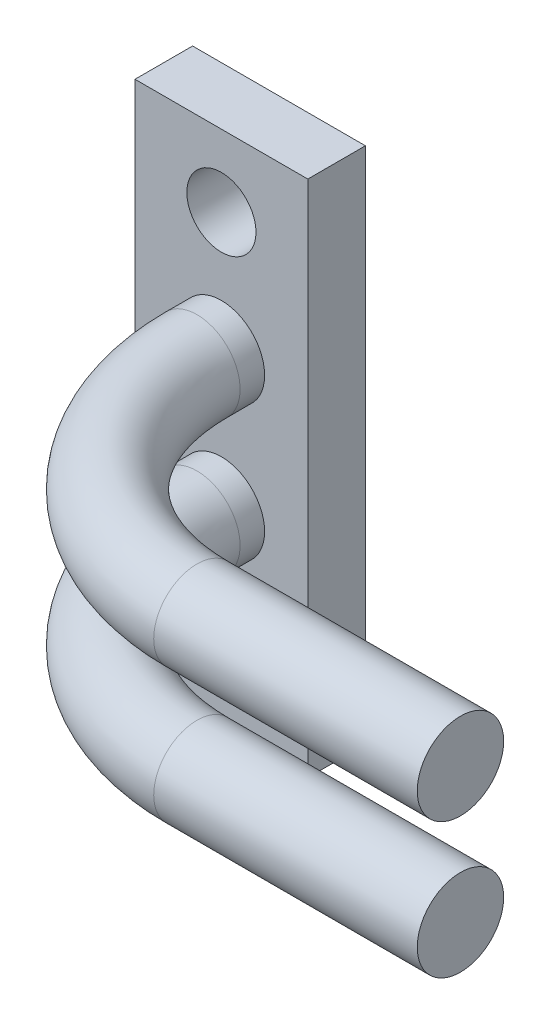
ISO-10303-21;
HEADER;
FILE_DESCRIPTION(('STEP AP214'),'2;1');
FILE_NAME('part.step','',(''),(''),'','','');
FILE_SCHEMA(('AUTOMOTIVE_DESIGN { 1 0 10303 214 1 1 1 1 }'));
ENDSEC;
DATA;
#1=APPLICATION_CONTEXT('core data for automotive mechanical design processes');
#2=APPLICATION_PROTOCOL_DEFINITION('international standard','automotive_design',2000,#1);
#3=PRODUCT_CONTEXT('',#1,'mechanical');
#4=PRODUCT('Part','Part','',(#3));
#5=PRODUCT_RELATED_PRODUCT_CATEGORY('part','',(#4));
#6=PRODUCT_DEFINITION_FORMATION('','',#4);
#7=PRODUCT_DEFINITION_CONTEXT('part definition',#1,'design');
#8=PRODUCT_DEFINITION('design','',#6,#7);
#9=PRODUCT_DEFINITION_SHAPE('','',#8);
#10=(LENGTH_UNIT() NAMED_UNIT(*) SI_UNIT(.MILLI.,.METRE.));
#11=(NAMED_UNIT(*) PLANE_ANGLE_UNIT() SI_UNIT($,.RADIAN.));
#12=(NAMED_UNIT(*) SI_UNIT($,.STERADIAN.) SOLID_ANGLE_UNIT());
#13=UNCERTAINTY_MEASURE_WITH_UNIT(LENGTH_MEASURE(1.E-05),#10,'distance_accuracy_value','');
#14=(GEOMETRIC_REPRESENTATION_CONTEXT(3) GLOBAL_UNCERTAINTY_ASSIGNED_CONTEXT((#13)) GLOBAL_UNIT_ASSIGNED_CONTEXT((#10,
#11,#12)) REPRESENTATION_CONTEXT('',''));
#15=CARTESIAN_POINT('',(0.,0.,0.));
#16=DIRECTION('',(0.,0.,1.));
#17=DIRECTION('',(1.,0.,0.));
#18=AXIS2_PLACEMENT_3D('',#15,#16,#17);
#19=CARTESIAN_POINT('',(3.,9.,2.));
#20=DIRECTION('',(0.,0.,-1.));
#21=DIRECTION('',(-1.,0.,0.));
#22=AXIS2_PLACEMENT_3D('',#19,#20,#21);
#23=PLANE('',#22);
#24=CARTESIAN_POINT('',(0.,-6.5,2.));
#25=DIRECTION('',(0.,0.,1.));
#26=DIRECTION('',(-1.,0.,0.));
#27=AXIS2_PLACEMENT_3D('',#24,#25,#26);
#28=CIRCLE('',#27,1.2);
#29=CARTESIAN_POINT('',(-1.19999999999999,-6.5,2.));
#30=VERTEX_POINT('',#29);
#31=EDGE_CURVE('E130',#30,#30,#28,.T.);
#32=ORIENTED_EDGE('',*,*,#31,.F.);
#33=EDGE_LOOP('',(#32));
#34=FACE_BOUND('',#33,.T.);
#35=CARTESIAN_POINT('',(0.,6.5,2.));
#36=DIRECTION('',(0.,0.,1.));
#37=DIRECTION('',(1.,0.,0.));
#38=AXIS2_PLACEMENT_3D('',#35,#36,#37);
#39=CIRCLE('',#38,1.2);
#40=CARTESIAN_POINT('',(1.2,6.5,2.));
#41=VERTEX_POINT('',#40);
#42=EDGE_CURVE('E119',#41,#41,#39,.T.);
#43=ORIENTED_EDGE('',*,*,#42,.F.);
#44=EDGE_LOOP('',(#43));
#45=FACE_BOUND('',#44,.T.);
#46=CARTESIAN_POINT('',(0.,-2.35,2.));
#47=DIRECTION('',(0.,0.,1.));
#48=DIRECTION('',(1.,0.,0.));
#49=AXIS2_PLACEMENT_3D('',#46,#47,#48);
#50=CIRCLE('',#49,1.5);
#51=CARTESIAN_POINT('',(1.5,-2.35,2.));
#52=VERTEX_POINT('',#51);
#53=EDGE_CURVE('E41',#52,#52,#50,.T.);
#54=ORIENTED_EDGE('',*,*,#53,.F.);
#55=EDGE_LOOP('',(#54));
#56=FACE_BOUND('',#55,.T.);
#57=DIRECTION('',(0.,1.,0.));
#58=VECTOR('',#57,1.);
#59=CARTESIAN_POINT('',(3.,-9.,2.));
#60=LINE('',#59,#58);
#61=CARTESIAN_POINT('',(3.,-9.,2.));
#62=VERTEX_POINT('',#61);
#63=CARTESIAN_POINT('',(3.,9.,2.));
#64=VERTEX_POINT('',#63);
#65=EDGE_CURVE('E86',#62,#64,#60,.T.);
#66=ORIENTED_EDGE('',*,*,#65,.T.);
#67=DIRECTION('',(-1.,0.,0.));
#68=VECTOR('',#67,1.);
#69=CARTESIAN_POINT('',(-3.,9.,2.));
#70=LINE('',#69,#68);
#71=CARTESIAN_POINT('',(-3.,9.,2.));
#72=VERTEX_POINT('',#71);
#73=EDGE_CURVE('E81',#64,#72,#70,.T.);
#74=ORIENTED_EDGE('',*,*,#73,.T.);
#75=DIRECTION('',(0.,-1.,0.));
#76=VECTOR('',#75,1.);
#77=CARTESIAN_POINT('',(-3.,-9.,2.));
#78=LINE('',#77,#76);
#79=CARTESIAN_POINT('',(-3.,-9.,2.));
#80=VERTEX_POINT('',#79);
#81=EDGE_CURVE('E84',#72,#80,#78,.T.);
#82=ORIENTED_EDGE('',*,*,#81,.T.);
#83=DIRECTION('',(1.,0.,0.));
#84=VECTOR('',#83,1.);
#85=CARTESIAN_POINT('',(-3.,-9.,2.));
#86=LINE('',#85,#84);
#87=EDGE_CURVE('E50',#80,#62,#86,.T.);
#88=ORIENTED_EDGE('',*,*,#87,.T.);
#89=EDGE_LOOP('',(#66,#74,#82,#88));
#90=FACE_BOUND('',#89,.T.);
#91=CARTESIAN_POINT('',(0.,2.35,2.));
#92=DIRECTION('',(0.,0.,1.));
#93=DIRECTION('',(1.,0.,0.));
#94=AXIS2_PLACEMENT_3D('',#91,#92,#93);
#95=CIRCLE('',#94,1.5);
#96=CARTESIAN_POINT('',(1.5,2.35,2.));
#97=VERTEX_POINT('',#96);
#98=EDGE_CURVE('E11',#97,#97,#95,.T.);
#99=ORIENTED_EDGE('',*,*,#98,.F.);
#100=EDGE_LOOP('',(#99));
#101=FACE_BOUND('',#100,.T.);
#102=ADVANCED_FACE('F31',(#34,#45,#56,#90,#101),#23,.F.);
#103=CARTESIAN_POINT('',(3.,9.,0.));
#104=DIRECTION('',(0.,0.,-1.));
#105=DIRECTION('',(-1.,0.,0.));
#106=AXIS2_PLACEMENT_3D('',#103,#104,#105);
#107=PLANE('',#106);
#108=CARTESIAN_POINT('',(0.,-6.5,0.));
#109=DIRECTION('',(0.,0.,-1.));
#110=DIRECTION('',(-1.,0.,0.));
#111=AXIS2_PLACEMENT_3D('',#108,#109,#110);
#112=CIRCLE('',#111,1.2);
#113=CARTESIAN_POINT('',(-1.19999999999999,-6.5,0.));
#114=VERTEX_POINT('',#113);
#115=EDGE_CURVE('E35',#114,#114,#112,.T.);
#116=ORIENTED_EDGE('',*,*,#115,.F.);
#117=EDGE_LOOP('',(#116));
#118=FACE_BOUND('',#117,.T.);
#119=CARTESIAN_POINT('',(0.,6.5,0.));
#120=DIRECTION('',(0.,0.,-1.));
#121=DIRECTION('',(-1.,0.,0.));
#122=AXIS2_PLACEMENT_3D('',#119,#120,#121);
#123=CIRCLE('',#122,1.2);
#124=CARTESIAN_POINT('',(-1.2,6.5,0.));
#125=VERTEX_POINT('',#124);
#126=EDGE_CURVE('E116',#125,#125,#123,.T.);
#127=ORIENTED_EDGE('',*,*,#126,.F.);
#128=EDGE_LOOP('',(#127));
#129=FACE_BOUND('',#128,.T.);
#130=CARTESIAN_POINT('',(0.,2.35,0.));
#131=DIRECTION('',(0.,0.,-1.));
#132=DIRECTION('',(-1.,0.,0.));
#133=AXIS2_PLACEMENT_3D('',#130,#131,#132);
#134=CIRCLE('',#133,1.5);
#135=CARTESIAN_POINT('',(-1.5,2.35,0.));
#136=VERTEX_POINT('',#135);
#137=EDGE_CURVE('E104',#136,#136,#134,.T.);
#138=ORIENTED_EDGE('',*,*,#137,.F.);
#139=EDGE_LOOP('',(#138));
#140=FACE_BOUND('',#139,.T.);
#141=DIRECTION('',(0.,1.,0.));
#142=VECTOR('',#141,1.);
#143=CARTESIAN_POINT('',(3.,-9.,0.));
#144=LINE('',#143,#142);
#145=CARTESIAN_POINT('',(3.,-9.,0.));
#146=VERTEX_POINT('',#145);
#147=CARTESIAN_POINT('',(3.,9.,0.));
#148=VERTEX_POINT('',#147);
#149=EDGE_CURVE('E101',#146,#148,#144,.T.);
#150=ORIENTED_EDGE('',*,*,#149,.F.);
#151=DIRECTION('',(1.,0.,0.));
#152=VECTOR('',#151,1.);
#153=CARTESIAN_POINT('',(-3.,-9.,0.));
#154=LINE('',#153,#152);
#155=CARTESIAN_POINT('',(-3.,-9.,0.));
#156=VERTEX_POINT('',#155);
#157=EDGE_CURVE('E73',#156,#146,#154,.T.);
#158=ORIENTED_EDGE('',*,*,#157,.F.);
#159=DIRECTION('',(0.,-1.,0.));
#160=VECTOR('',#159,1.);
#161=CARTESIAN_POINT('',(-3.,-9.,0.));
#162=LINE('',#161,#160);
#163=CARTESIAN_POINT('',(-3.,9.,0.));
#164=VERTEX_POINT('',#163);
#165=EDGE_CURVE('E67',#164,#156,#162,.T.);
#166=ORIENTED_EDGE('',*,*,#165,.F.);
#167=DIRECTION('',(-1.,0.,0.));
#168=VECTOR('',#167,1.);
#169=CARTESIAN_POINT('',(-3.,9.,0.));
#170=LINE('',#169,#168);
#171=EDGE_CURVE('E91',#148,#164,#170,.T.);
#172=ORIENTED_EDGE('',*,*,#171,.F.);
#173=EDGE_LOOP('',(#150,#158,#166,#172));
#174=FACE_BOUND('',#173,.T.);
#175=CARTESIAN_POINT('',(0.,-2.35,0.));
#176=DIRECTION('',(0.,0.,-1.));
#177=DIRECTION('',(-1.,0.,0.));
#178=AXIS2_PLACEMENT_3D('',#175,#176,#177);
#179=CIRCLE('',#178,1.5);
#180=CARTESIAN_POINT('',(-1.5,-2.35,0.));
#181=VERTEX_POINT('',#180);
#182=EDGE_CURVE('E149',#181,#181,#179,.T.);
#183=ORIENTED_EDGE('',*,*,#182,.F.);
#184=EDGE_LOOP('',(#183));
#185=FACE_BOUND('',#184,.T.);
#186=ADVANCED_FACE('F157',(#118,#129,#140,#174,#185),#107,.T.);
#187=CARTESIAN_POINT('',(3.,-9.,2.));
#188=DIRECTION('',(-1.,0.,0.));
#189=DIRECTION('',(0.,0.,1.));
#190=AXIS2_PLACEMENT_3D('',#187,#188,#189);
#191=PLANE('',#190);
#192=ORIENTED_EDGE('',*,*,#149,.T.);
#193=DIRECTION('',(0.,0.,-1.));
#194=VECTOR('',#193,1.);
#195=CARTESIAN_POINT('',(3.,9.,2.));
#196=LINE('',#195,#194);
#197=EDGE_CURVE('E92',#64,#148,#196,.T.);
#198=ORIENTED_EDGE('',*,*,#197,.F.);
#199=ORIENTED_EDGE('',*,*,#65,.F.);
#200=DIRECTION('',(0.,0.,-1.));
#201=VECTOR('',#200,1.);
#202=CARTESIAN_POINT('',(3.,-9.,2.));
#203=LINE('',#202,#201);
#204=EDGE_CURVE('E97',#62,#146,#203,.T.);
#205=ORIENTED_EDGE('',*,*,#204,.T.);
#206=EDGE_LOOP('',(#192,#198,#199,#205));
#207=FACE_BOUND('',#206,.T.);
#208=ADVANCED_FACE('F160',(#207),#191,.F.);
#209=CARTESIAN_POINT('',(-3.,9.,2.));
#210=DIRECTION('',(0.,-1.,0.));
#211=DIRECTION('',(0.,0.,-1.));
#212=AXIS2_PLACEMENT_3D('',#209,#210,#211);
#213=PLANE('',#212);
#214=ORIENTED_EDGE('',*,*,#171,.T.);
#215=DIRECTION('',(0.,0.,-1.));
#216=VECTOR('',#215,1.);
#217=CARTESIAN_POINT('',(-3.,9.,2.));
#218=LINE('',#217,#216);
#219=EDGE_CURVE('E89',#72,#164,#218,.T.);
#220=ORIENTED_EDGE('',*,*,#219,.F.);
#221=ORIENTED_EDGE('',*,*,#73,.F.);
#222=ORIENTED_EDGE('',*,*,#197,.T.);
#223=EDGE_LOOP('',(#214,#220,#221,#222));
#224=FACE_BOUND('',#223,.T.);
#225=ADVANCED_FACE('F90',(#224),#213,.F.);
#226=CARTESIAN_POINT('',(-3.,-9.,2.));
#227=DIRECTION('',(1.,0.,0.));
#228=DIRECTION('',(0.,0.,-1.));
#229=AXIS2_PLACEMENT_3D('',#226,#227,#228);
#230=PLANE('',#229);
#231=ORIENTED_EDGE('',*,*,#165,.T.);
#232=DIRECTION('',(0.,0.,-1.));
#233=VECTOR('',#232,1.);
#234=CARTESIAN_POINT('',(-3.,-9.,2.));
#235=LINE('',#234,#233);
#236=EDGE_CURVE('E93',#80,#156,#235,.T.);
#237=ORIENTED_EDGE('',*,*,#236,.F.);
#238=ORIENTED_EDGE('',*,*,#81,.F.);
#239=ORIENTED_EDGE('',*,*,#219,.T.);
#240=EDGE_LOOP('',(#231,#237,#238,#239));
#241=FACE_BOUND('',#240,.T.);
#242=ADVANCED_FACE('F95',(#241),#230,.F.);
#243=CARTESIAN_POINT('',(-3.,-9.,2.));
#244=DIRECTION('',(0.,1.,0.));
#245=DIRECTION('',(0.,0.,1.));
#246=AXIS2_PLACEMENT_3D('',#243,#244,#245);
#247=PLANE('',#246);
#248=ORIENTED_EDGE('',*,*,#157,.T.);
#249=ORIENTED_EDGE('',*,*,#204,.F.);
#250=ORIENTED_EDGE('',*,*,#87,.F.);
#251=ORIENTED_EDGE('',*,*,#236,.T.);
#252=EDGE_LOOP('',(#248,#249,#250,#251));
#253=FACE_BOUND('',#252,.T.);
#254=ADVANCED_FACE('F177',(#253),#247,.F.);
#255=CARTESIAN_POINT('',(0.,2.35,-2.1));
#256=DIRECTION('',(0.,0.,1.));
#257=DIRECTION('',(1.,0.,0.));
#258=AXIS2_PLACEMENT_3D('',#255,#256,#257);
#259=CYLINDRICAL_SURFACE('',#258,1.5);
#260=CARTESIAN_POINT('',(0.,2.35,-0.6));
#261=DIRECTION('',(0.,0.,1.));
#262=DIRECTION('',(1.,0.,0.));
#263=AXIS2_PLACEMENT_3D('',#260,#261,#262);
#264=CIRCLE('',#263,1.5);
#265=CARTESIAN_POINT('',(1.5,2.35,-0.6));
#266=VERTEX_POINT('',#265);
#267=EDGE_CURVE('E114',#266,#266,#264,.T.);
#268=ORIENTED_EDGE('',*,*,#267,.T.);
#269=EDGE_LOOP('',(#268));
#270=FACE_BOUND('',#269,.T.);
#271=ORIENTED_EDGE('',*,*,#137,.T.);
#272=EDGE_LOOP('',(#271));
#273=FACE_BOUND('',#272,.T.);
#274=ADVANCED_FACE('F155',(#270,#273),#259,.T.);
#275=CARTESIAN_POINT('',(0.,-2.35,-2.1));
#276=DIRECTION('',(0.,0.,1.));
#277=DIRECTION('',(1.,0.,0.));
#278=AXIS2_PLACEMENT_3D('',#275,#276,#277);
#279=CYLINDRICAL_SURFACE('',#278,1.5);
#280=CARTESIAN_POINT('',(0.,-2.35,-0.6));
#281=DIRECTION('',(0.,0.,1.));
#282=DIRECTION('',(1.,0.,0.));
#283=AXIS2_PLACEMENT_3D('',#280,#281,#282);
#284=CIRCLE('',#283,1.5);
#285=CARTESIAN_POINT('',(1.5,-2.35,-0.6));
#286=VERTEX_POINT('',#285);
#287=EDGE_CURVE('E111',#286,#286,#284,.T.);
#288=ORIENTED_EDGE('',*,*,#287,.T.);
#289=EDGE_LOOP('',(#288));
#290=FACE_BOUND('',#289,.T.);
#291=ORIENTED_EDGE('',*,*,#182,.T.);
#292=EDGE_LOOP('',(#291));
#293=FACE_BOUND('',#292,.T.);
#294=ADVANCED_FACE('F167',(#290,#293),#279,.T.);
#295=CARTESIAN_POINT('',(0.,-2.35,-0.6));
#296=DIRECTION('',(0.,0.,1.));
#297=DIRECTION('',(1.,0.,0.));
#298=AXIS2_PLACEMENT_3D('',#295,#296,#297);
#299=SPHERICAL_SURFACE('',#298,1.5);
#300=ORIENTED_EDGE('',*,*,#287,.F.);
#301=EDGE_LOOP('',(#300));
#302=FACE_BOUND('',#301,.T.);
#303=ADVANCED_FACE('F169',(#302),#299,.T.);
#304=CARTESIAN_POINT('',(0.,2.35,-0.6));
#305=DIRECTION('',(0.,0.,1.));
#306=DIRECTION('',(1.,0.,0.));
#307=AXIS2_PLACEMENT_3D('',#304,#305,#306);
#308=SPHERICAL_SURFACE('',#307,1.5);
#309=ORIENTED_EDGE('',*,*,#267,.F.);
#310=EDGE_LOOP('',(#309));
#311=FACE_BOUND('',#310,.T.);
#312=ADVANCED_FACE('F33',(#311),#308,.T.);
#313=CARTESIAN_POINT('',(7.5,-2.35,10.35));
#314=DIRECTION('',(1.,0.,0.));
#315=DIRECTION('',(0.,0.,-1.));
#316=AXIS2_PLACEMENT_3D('',#313,#314,#315);
#317=CYLINDRICAL_SURFACE('',#316,1.5);
#318=CARTESIAN_POINT('',(7.5,-2.35,10.35));
#319=DIRECTION('',(1.,0.,0.));
#320=DIRECTION('',(0.,0.,-1.));
#321=AXIS2_PLACEMENT_3D('',#318,#319,#320);
#322=CIRCLE('',#321,1.5);
#323=CARTESIAN_POINT('',(7.5,-2.35,11.85));
#324=VERTEX_POINT('',#323);
#325=EDGE_CURVE('E141',#324,#324,#322,.T.);
#326=ORIENTED_EDGE('',*,*,#325,.T.);
#327=EDGE_LOOP('',(#326));
#328=FACE_BOUND('',#327,.T.);
#329=CARTESIAN_POINT('',(16.65,-2.35,10.35));
#330=DIRECTION('',(1.,0.,0.));
#331=DIRECTION('',(0.,0.,-1.));
#332=AXIS2_PLACEMENT_3D('',#329,#330,#331);
#333=CIRCLE('',#332,1.5);
#334=CARTESIAN_POINT('',(16.65,-2.35,8.85));
#335=VERTEX_POINT('',#334);
#336=EDGE_CURVE('E146',#335,#335,#333,.T.);
#337=ORIENTED_EDGE('',*,*,#336,.F.);
#338=EDGE_LOOP('',(#337));
#339=FACE_BOUND('',#338,.T.);
#340=ADVANCED_FACE('F237',(#328,#339),#317,.T.);
#341=CARTESIAN_POINT('',(7.5,-2.35,2.85));
#342=DIRECTION('',(0.,1.,0.));
#343=DIRECTION('',(0.,0.,1.));
#344=AXIS2_PLACEMENT_3D('',#341,#342,#343);
#345=TOROIDAL_SURFACE('',#344,7.5,1.5);
#346=CARTESIAN_POINT('',(0.,-2.35,2.85));
#347=DIRECTION('',(0.,0.,1.));
#348=DIRECTION('',(1.,0.,0.));
#349=AXIS2_PLACEMENT_3D('',#346,#347,#348);
#350=CIRCLE('',#349,1.5);
#351=CARTESIAN_POINT('',(-1.5,-2.35,2.85));
#352=VERTEX_POINT('',#351);
#353=EDGE_CURVE('E138',#352,#352,#350,.T.);
#354=CARTESIAN_POINT('',(7.5,-2.35,2.85));
#355=DIRECTION('',(0.,1.,0.));
#356=DIRECTION('',(0.,0.,1.));
#357=AXIS2_PLACEMENT_3D('',#354,#355,#356);
#358=CIRCLE('',#357,9.);
#359=EDGE_CURVE('',#352,#324,#358,.T.);
#360=ORIENTED_EDGE('',*,*,#353,.T.);
#361=ORIENTED_EDGE('',*,*,#325,.F.);
#362=ORIENTED_EDGE('',*,*,#359,.T.);
#363=ORIENTED_EDGE('',*,*,#359,.F.);
#364=EDGE_LOOP('',(#360,#362,#361,#363));
#365=FACE_BOUND('',#364,.T.);
#366=ADVANCED_FACE('F247',(#365),#345,.T.);
#367=CARTESIAN_POINT('',(0.,-2.35,2.85));
#368=DIRECTION('',(0.,0.,-1.));
#369=DIRECTION('',(-1.,0.,0.));
#370=AXIS2_PLACEMENT_3D('',#367,#368,#369);
#371=CYLINDRICAL_SURFACE('',#370,1.5);
#372=ORIENTED_EDGE('',*,*,#353,.F.);
#373=EDGE_LOOP('',(#372));
#374=FACE_BOUND('',#373,.T.);
#375=ORIENTED_EDGE('',*,*,#53,.T.);
#376=EDGE_LOOP('',(#375));
#377=FACE_BOUND('',#376,.T.);
#378=ADVANCED_FACE('F256',(#374,#377),#371,.T.);
#379=CARTESIAN_POINT('',(16.65,-2.35,10.35));
#380=DIRECTION('',(1.,0.,0.));
#381=DIRECTION('',(0.,0.,-1.));
#382=AXIS2_PLACEMENT_3D('',#379,#380,#381);
#383=PLANE('',#382);
#384=ORIENTED_EDGE('',*,*,#336,.T.);
#385=EDGE_LOOP('',(#384));
#386=FACE_BOUND('',#385,.T.);
#387=ADVANCED_FACE('F266',(#386),#383,.T.);
#388=CARTESIAN_POINT('',(7.5,2.35,10.35));
#389=DIRECTION('',(1.,0.,0.));
#390=DIRECTION('',(0.,0.,-1.));
#391=AXIS2_PLACEMENT_3D('',#388,#389,#390);
#392=CYLINDRICAL_SURFACE('',#391,1.5);
#393=CARTESIAN_POINT('',(7.5,2.35,10.35));
#394=DIRECTION('',(1.,0.,0.));
#395=DIRECTION('',(0.,0.,-1.));
#396=AXIS2_PLACEMENT_3D('',#393,#394,#395);
#397=CIRCLE('',#396,1.5);
#398=CARTESIAN_POINT('',(7.5,2.35,11.85));
#399=VERTEX_POINT('',#398);
#400=EDGE_CURVE('E123',#399,#399,#397,.T.);
#401=ORIENTED_EDGE('',*,*,#400,.T.);
#402=EDGE_LOOP('',(#401));
#403=FACE_BOUND('',#402,.T.);
#404=CARTESIAN_POINT('',(16.65,2.35,10.35));
#405=DIRECTION('',(1.,0.,0.));
#406=DIRECTION('',(0.,0.,-1.));
#407=AXIS2_PLACEMENT_3D('',#404,#405,#406);
#408=CIRCLE('',#407,1.5);
#409=CARTESIAN_POINT('',(16.65,2.35,8.85));
#410=VERTEX_POINT('',#409);
#411=EDGE_CURVE('E135',#410,#410,#408,.T.);
#412=ORIENTED_EDGE('',*,*,#411,.F.);
#413=EDGE_LOOP('',(#412));
#414=FACE_BOUND('',#413,.T.);
#415=ADVANCED_FACE('F276',(#403,#414),#392,.T.);
#416=CARTESIAN_POINT('',(7.5,2.35,2.85));
#417=DIRECTION('',(0.,1.,0.));
#418=DIRECTION('',(0.,0.,1.));
#419=AXIS2_PLACEMENT_3D('',#416,#417,#418);
#420=TOROIDAL_SURFACE('',#419,7.5,1.5);
#421=CARTESIAN_POINT('',(0.,2.35,2.85));
#422=DIRECTION('',(0.,0.,1.));
#423=DIRECTION('',(1.,0.,0.));
#424=AXIS2_PLACEMENT_3D('',#421,#422,#423);
#425=CIRCLE('',#424,1.5);
#426=CARTESIAN_POINT('',(-1.5,2.35,2.85));
#427=VERTEX_POINT('',#426);
#428=EDGE_CURVE('E118',#427,#427,#425,.T.);
#429=CARTESIAN_POINT('',(7.5,2.35,2.85));
#430=DIRECTION('',(0.,1.,0.));
#431=DIRECTION('',(0.,0.,1.));
#432=AXIS2_PLACEMENT_3D('',#429,#430,#431);
#433=CIRCLE('',#432,9.);
#434=EDGE_CURVE('',#427,#399,#433,.T.);
#435=ORIENTED_EDGE('',*,*,#428,.T.);
#436=ORIENTED_EDGE('',*,*,#400,.F.);
#437=ORIENTED_EDGE('',*,*,#434,.T.);
#438=ORIENTED_EDGE('',*,*,#434,.F.);
#439=EDGE_LOOP('',(#435,#437,#436,#438));
#440=FACE_BOUND('',#439,.T.);
#441=ADVANCED_FACE('F286',(#440),#420,.T.);
#442=CARTESIAN_POINT('',(0.,2.35,2.85));
#443=DIRECTION('',(0.,0.,-1.));
#444=DIRECTION('',(-1.,0.,0.));
#445=AXIS2_PLACEMENT_3D('',#442,#443,#444);
#446=CYLINDRICAL_SURFACE('',#445,1.5);
#447=ORIENTED_EDGE('',*,*,#428,.F.);
#448=EDGE_LOOP('',(#447));
#449=FACE_BOUND('',#448,.T.);
#450=ORIENTED_EDGE('',*,*,#98,.T.);
#451=EDGE_LOOP('',(#450));
#452=FACE_BOUND('',#451,.T.);
#453=ADVANCED_FACE('F296',(#449,#452),#446,.T.);
#454=CARTESIAN_POINT('',(16.65,2.35,10.35));
#455=DIRECTION('',(1.,0.,0.));
#456=DIRECTION('',(0.,0.,-1.));
#457=AXIS2_PLACEMENT_3D('',#454,#455,#456);
#458=PLANE('',#457);
#459=ORIENTED_EDGE('',*,*,#411,.T.);
#460=EDGE_LOOP('',(#459));
#461=FACE_BOUND('',#460,.T.);
#462=ADVANCED_FACE('F306',(#461),#458,.T.);
#463=CARTESIAN_POINT('',(0.,6.5,-2.1));
#464=DIRECTION('',(0.,0.,1.));
#465=DIRECTION('',(1.,0.,0.));
#466=AXIS2_PLACEMENT_3D('',#463,#464,#465);
#467=CYLINDRICAL_SURFACE('',#466,1.2);
#468=ORIENTED_EDGE('',*,*,#126,.T.);
#469=EDGE_LOOP('',(#468));
#470=FACE_BOUND('',#469,.T.);
#471=ORIENTED_EDGE('',*,*,#42,.T.);
#472=EDGE_LOOP('',(#471));
#473=FACE_BOUND('',#472,.T.);
#474=ADVANCED_FACE('F315',(#470,#473),#467,.F.);
#475=CARTESIAN_POINT('',(0.,-6.5,-2.1));
#476=DIRECTION('',(0.,0.,1.));
#477=DIRECTION('',(1.,0.,0.));
#478=AXIS2_PLACEMENT_3D('',#475,#476,#477);
#479=CYLINDRICAL_SURFACE('',#478,1.2);
#480=ORIENTED_EDGE('',*,*,#115,.T.);
#481=EDGE_LOOP('',(#480));
#482=FACE_BOUND('',#481,.T.);
#483=ORIENTED_EDGE('',*,*,#31,.T.);
#484=EDGE_LOOP('',(#483));
#485=FACE_BOUND('',#484,.T.);
#486=ADVANCED_FACE('F332',(#482,#485),#479,.F.);
#487=CLOSED_SHELL('',(#102,#186,#208,#225,#242,#254,#274,#294,#303,#312,#340,#366,#378,#387,
#415,#441,#453,#462,#474,#486));
#488=MANIFOLD_SOLID_BREP('B2',#487);
#489=ADVANCED_BREP_SHAPE_REPRESENTATION('',(#18,#488),#14);
#490=SHAPE_DEFINITION_REPRESENTATION(#9,#489);
ENDSEC;
END-ISO-10303-21;
